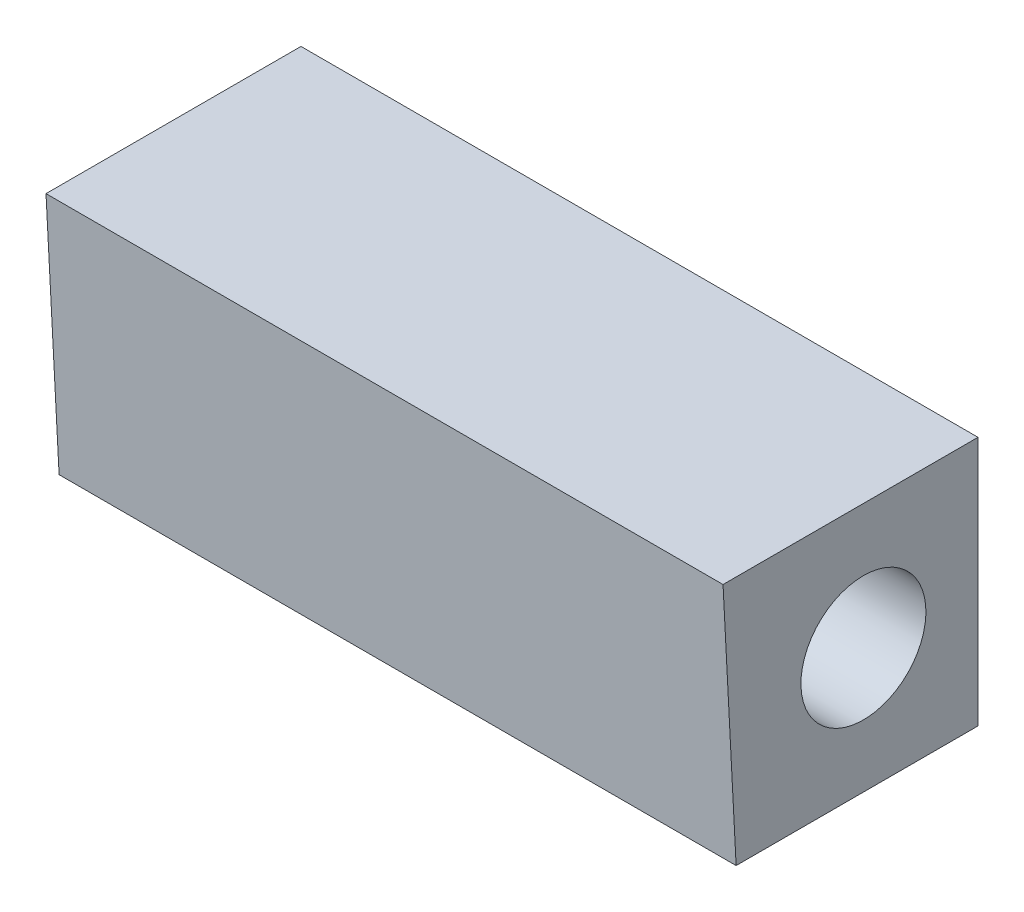
ISO-10303-21;
HEADER;
FILE_DESCRIPTION(('STEP AP214'),'2;1');
FILE_NAME('part.step','',(''),(''),'','','');
FILE_SCHEMA(('AUTOMOTIVE_DESIGN { 1 0 10303 214 1 1 1 1 }'));
ENDSEC;
DATA;
#1=APPLICATION_CONTEXT('core data for automotive mechanical design processes');
#2=APPLICATION_PROTOCOL_DEFINITION('international standard','automotive_design',2000,#1);
#3=PRODUCT_CONTEXT('',#1,'mechanical');
#4=PRODUCT('Part','Part','',(#3));
#5=PRODUCT_RELATED_PRODUCT_CATEGORY('part','',(#4));
#6=PRODUCT_DEFINITION_FORMATION('','',#4);
#7=PRODUCT_DEFINITION_CONTEXT('part definition',#1,'design');
#8=PRODUCT_DEFINITION('design','',#6,#7);
#9=PRODUCT_DEFINITION_SHAPE('','',#8);
#10=(LENGTH_UNIT() NAMED_UNIT(*) SI_UNIT(.MILLI.,.METRE.));
#11=(NAMED_UNIT(*) PLANE_ANGLE_UNIT() SI_UNIT($,.RADIAN.));
#12=(NAMED_UNIT(*) SI_UNIT($,.STERADIAN.) SOLID_ANGLE_UNIT());
#13=UNCERTAINTY_MEASURE_WITH_UNIT(LENGTH_MEASURE(1.E-05),#10,'distance_accuracy_value','');
#14=(GEOMETRIC_REPRESENTATION_CONTEXT(3) GLOBAL_UNCERTAINTY_ASSIGNED_CONTEXT((#13)) GLOBAL_UNIT_ASSIGNED_CONTEXT((#10,
#11,#12)) REPRESENTATION_CONTEXT('',''));
#15=CARTESIAN_POINT('',(0.,0.,0.));
#16=DIRECTION('',(0.,0.,1.));
#17=DIRECTION('',(1.,0.,0.));
#18=AXIS2_PLACEMENT_3D('',#15,#16,#17);
#19=CARTESIAN_POINT('',(80.,-28.,-107.));
#20=DIRECTION('',(0.,-1.,0.));
#21=DIRECTION('',(1.,0.,0.));
#22=AXIS2_PLACEMENT_3D('',#19,#20,#21);
#23=PLANE('',#22);
#24=DIRECTION('',(-1.,0.,0.));
#25=VECTOR('',#24,1.);
#26=CARTESIAN_POINT('',(80.,-28.,-94.7605805656528));
#27=LINE('',#26,#25);
#28=CARTESIAN_POINT('',(47.5,-28.,-94.7605805656528));
#29=VERTEX_POINT('',#28);
#30=CARTESIAN_POINT('',(15.,-28.,-94.7605805656528));
#31=VERTEX_POINT('',#30);
#32=EDGE_CURVE('E11',#29,#31,#27,.T.);
#33=ORIENTED_EDGE('',*,*,#32,.F.);
#34=DIRECTION('',(0.,0.,-1.));
#35=VECTOR('',#34,1.);
#36=CARTESIAN_POINT('',(47.5,-28.,-94.7605805656528));
#37=LINE('',#36,#35);
#38=CARTESIAN_POINT('',(47.5,-28.,-107.));
#39=VERTEX_POINT('',#38);
#40=EDGE_CURVE('E77',#29,#39,#37,.T.);
#41=ORIENTED_EDGE('',*,*,#40,.T.);
#42=DIRECTION('',(-1.,0.,0.));
#43=VECTOR('',#42,1.);
#44=CARTESIAN_POINT('',(80.,-28.,-107.));
#45=LINE('',#44,#43);
#46=CARTESIAN_POINT('',(15.,-28.,-107.));
#47=VERTEX_POINT('',#46);
#48=EDGE_CURVE('E61',#39,#47,#45,.T.);
#49=ORIENTED_EDGE('',*,*,#48,.T.);
#50=DIRECTION('',(0.,0.,1.));
#51=VECTOR('',#50,1.);
#52=CARTESIAN_POINT('',(15.,-28.,-107.));
#53=LINE('',#52,#51);
#54=EDGE_CURVE('E91',#47,#31,#53,.T.);
#55=ORIENTED_EDGE('',*,*,#54,.T.);
#56=EDGE_LOOP('',(#33,#41,#49,#55));
#57=FACE_BOUND('',#56,.T.);
#58=ADVANCED_FACE('F38',(#57),#23,.F.);
#59=CARTESIAN_POINT('',(80.,-28.,-94.7605805656528));
#60=DIRECTION('',(0.,0.0523359562429478,-0.998629534754574));
#61=DIRECTION('',(0.,0.998629534754574,0.0523359562429478));
#62=AXIS2_PLACEMENT_3D('',#59,#60,#61);
#63=PLANE('',#62);
#64=DIRECTION('',(-1.,0.,0.));
#65=VECTOR('',#64,1.);
#66=CARTESIAN_POINT('',(80.,-40.,-95.3894739170494));
#67=LINE('',#66,#65);
#68=CARTESIAN_POINT('',(47.5,-40.,-95.3894739170494));
#69=VERTEX_POINT('',#68);
#70=CARTESIAN_POINT('',(15.,-40.,-95.3894739170494));
#71=VERTEX_POINT('',#70);
#72=EDGE_CURVE('E46',#69,#71,#67,.T.);
#73=ORIENTED_EDGE('',*,*,#72,.F.);
#74=DIRECTION('',(0.,0.998629534754574,0.0523359562429478));
#75=VECTOR('',#74,1.);
#76=CARTESIAN_POINT('',(47.5,-28.,-94.7605805656528));
#77=LINE('',#76,#75);
#78=EDGE_CURVE('E80',#69,#29,#77,.T.);
#79=ORIENTED_EDGE('',*,*,#78,.T.);
#80=ORIENTED_EDGE('',*,*,#32,.T.);
#81=DIRECTION('',(0.,-0.998629534754574,-0.0523359562429478));
#82=VECTOR('',#81,1.);
#83=CARTESIAN_POINT('',(15.,-28.,-94.7605805656528));
#84=LINE('',#83,#82);
#85=EDGE_CURVE('E97',#31,#71,#84,.T.);
#86=ORIENTED_EDGE('',*,*,#85,.T.);
#87=EDGE_LOOP('',(#73,#79,#80,#86));
#88=FACE_BOUND('',#87,.T.);
#89=ADVANCED_FACE('F87',(#88),#63,.F.);
#90=CARTESIAN_POINT('',(80.,-40.,-95.3894739170494));
#91=DIRECTION('',(0.,1.,0.));
#92=DIRECTION('',(-1.,0.,0.));
#93=AXIS2_PLACEMENT_3D('',#90,#91,#92);
#94=PLANE('',#93);
#95=DIRECTION('',(-1.,0.,0.));
#96=VECTOR('',#95,1.);
#97=CARTESIAN_POINT('',(80.,-40.,-107.));
#98=LINE('',#97,#96);
#99=CARTESIAN_POINT('',(47.5,-40.,-107.));
#100=VERTEX_POINT('',#99);
#101=CARTESIAN_POINT('',(15.,-40.,-107.));
#102=VERTEX_POINT('',#101);
#103=EDGE_CURVE('E112',#100,#102,#98,.T.);
#104=ORIENTED_EDGE('',*,*,#103,.F.);
#105=DIRECTION('',(0.,0.,-1.));
#106=VECTOR('',#105,1.);
#107=CARTESIAN_POINT('',(47.5,-40.,-94.7605805656528));
#108=LINE('',#107,#106);
#109=EDGE_CURVE('E53',#69,#100,#108,.T.);
#110=ORIENTED_EDGE('',*,*,#109,.F.);
#111=ORIENTED_EDGE('',*,*,#72,.T.);
#112=DIRECTION('',(0.,0.,-1.));
#113=VECTOR('',#112,1.);
#114=CARTESIAN_POINT('',(15.,-40.,-95.3894739170494));
#115=LINE('',#114,#113);
#116=EDGE_CURVE('E100',#71,#102,#115,.T.);
#117=ORIENTED_EDGE('',*,*,#116,.T.);
#118=EDGE_LOOP('',(#104,#110,#111,#117));
#119=FACE_BOUND('',#118,.T.);
#120=ADVANCED_FACE('F117',(#119),#94,.F.);
#121=CARTESIAN_POINT('',(80.,-40.,-107.));
#122=DIRECTION('',(0.,0.,1.));
#123=DIRECTION('',(1.,0.,0.));
#124=AXIS2_PLACEMENT_3D('',#121,#122,#123);
#125=PLANE('',#124);
#126=ORIENTED_EDGE('',*,*,#48,.F.);
#127=DIRECTION('',(0.,1.,0.));
#128=VECTOR('',#127,1.);
#129=CARTESIAN_POINT('',(47.5,-28.,-107.));
#130=LINE('',#129,#128);
#131=EDGE_CURVE('E81',#100,#39,#130,.T.);
#132=ORIENTED_EDGE('',*,*,#131,.F.);
#133=ORIENTED_EDGE('',*,*,#103,.T.);
#134=DIRECTION('',(0.,1.,0.));
#135=VECTOR('',#134,1.);
#136=CARTESIAN_POINT('',(15.,-40.,-107.));
#137=LINE('',#136,#135);
#138=EDGE_CURVE('E107',#102,#47,#137,.T.);
#139=ORIENTED_EDGE('',*,*,#138,.T.);
#140=EDGE_LOOP('',(#126,#132,#133,#139));
#141=FACE_BOUND('',#140,.T.);
#142=ADVANCED_FACE('F121',(#141),#125,.F.);
#143=CARTESIAN_POINT('',(15.,0.,0.));
#144=DIRECTION('',(-1.,0.,0.));
#145=DIRECTION('',(0.,-1.,0.));
#146=AXIS2_PLACEMENT_3D('',#143,#144,#145);
#147=PLANE('',#146);
#148=ORIENTED_EDGE('',*,*,#54,.F.);
#149=ORIENTED_EDGE('',*,*,#138,.F.);
#150=ORIENTED_EDGE('',*,*,#116,.F.);
#151=ORIENTED_EDGE('',*,*,#85,.F.);
#152=EDGE_LOOP('',(#148,#149,#150,#151));
#153=FACE_BOUND('',#152,.T.);
#154=ADVANCED_FACE('F119',(#153),#147,.T.);
#155=CARTESIAN_POINT('',(47.5,-28.,-94.7605805656528));
#156=DIRECTION('',(-1.,0.,0.));
#157=DIRECTION('',(0.,-1.,0.));
#158=AXIS2_PLACEMENT_3D('',#155,#156,#157);
#159=PLANE('',#158);
#160=CARTESIAN_POINT('',(47.5,-34.,-101.5));
#161=DIRECTION('',(1.,0.,0.));
#162=DIRECTION('',(0.,1.,0.));
#163=AXIS2_PLACEMENT_3D('',#160,#161,#162);
#164=CIRCLE('',#163,3.00000000000001);
#165=CARTESIAN_POINT('',(47.5,-31.,-101.5));
#166=VERTEX_POINT('',#165);
#167=EDGE_CURVE('E128',#166,#166,#164,.T.);
#168=ORIENTED_EDGE('',*,*,#167,.F.);
#169=EDGE_LOOP('',(#168));
#170=FACE_BOUND('',#169,.T.);
#171=ORIENTED_EDGE('',*,*,#109,.T.);
#172=ORIENTED_EDGE('',*,*,#131,.T.);
#173=ORIENTED_EDGE('',*,*,#40,.F.);
#174=ORIENTED_EDGE('',*,*,#78,.F.);
#175=EDGE_LOOP('',(#171,#172,#173,#174));
#176=FACE_BOUND('',#175,.T.);
#177=ADVANCED_FACE('F79',(#170,#176),#159,.F.);
#178=CARTESIAN_POINT('',(42.5,-34.,-101.5));
#179=DIRECTION('',(1.,0.,0.));
#180=DIRECTION('',(0.,1.,0.));
#181=AXIS2_PLACEMENT_3D('',#178,#179,#180);
#182=CYLINDRICAL_SURFACE('',#181,3.00000000000001);
#183=CARTESIAN_POINT('',(42.5,-34.,-101.5));
#184=DIRECTION('',(1.,0.,0.));
#185=DIRECTION('',(0.,1.,0.));
#186=AXIS2_PLACEMENT_3D('',#183,#184,#185);
#187=CIRCLE('',#186,3.00000000000001);
#188=CARTESIAN_POINT('',(42.5,-31.,-101.5));
#189=VERTEX_POINT('',#188);
#190=EDGE_CURVE('E123',#189,#189,#187,.T.);
#191=ORIENTED_EDGE('',*,*,#190,.F.);
#192=EDGE_LOOP('',(#191));
#193=FACE_BOUND('',#192,.T.);
#194=ORIENTED_EDGE('',*,*,#167,.T.);
#195=EDGE_LOOP('',(#194));
#196=FACE_BOUND('',#195,.T.);
#197=ADVANCED_FACE('F135',(#193,#196),#182,.F.);
#198=CARTESIAN_POINT('',(42.5,-34.,-101.5));
#199=DIRECTION('',(1.,0.,0.));
#200=DIRECTION('',(0.,1.,0.));
#201=AXIS2_PLACEMENT_3D('',#198,#199,#200);
#202=PLANE('',#201);
#203=ORIENTED_EDGE('',*,*,#190,.T.);
#204=EDGE_LOOP('',(#203));
#205=FACE_BOUND('',#204,.T.);
#206=ADVANCED_FACE('F143',(#205),#202,.T.);
#207=CLOSED_SHELL('',(#58,#89,#120,#142,#154,#177,#197,#206));
#208=MANIFOLD_SOLID_BREP('B2',#207);
#209=ADVANCED_BREP_SHAPE_REPRESENTATION('',(#18,#208),#14);
#210=SHAPE_DEFINITION_REPRESENTATION(#9,#209);
ENDSEC;
END-ISO-10303-21;
